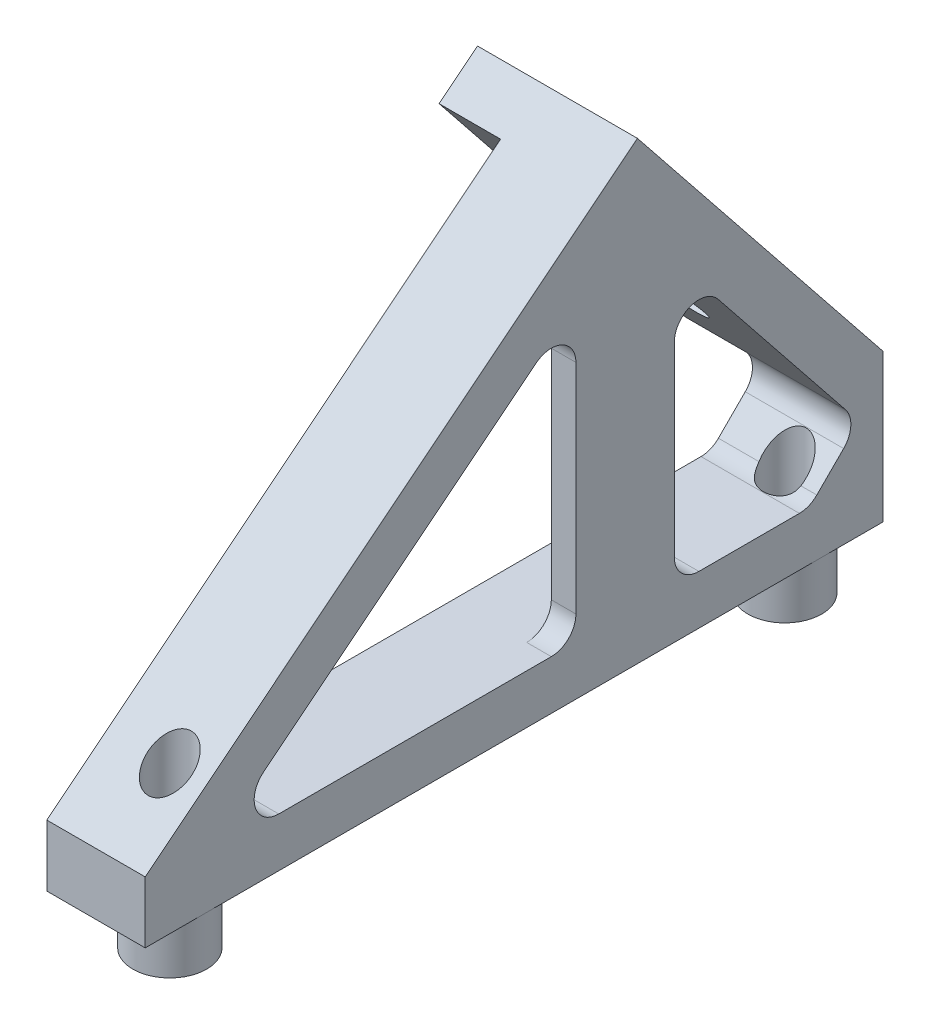
ISO-10303-21;
HEADER;
FILE_DESCRIPTION(('STEP AP214'),'2;1');
FILE_NAME('part.step','',(''),(''),'','','');
FILE_SCHEMA(('AUTOMOTIVE_DESIGN { 1 0 10303 214 1 1 1 1 }'));
ENDSEC;
DATA;
#1=APPLICATION_CONTEXT('core data for automotive mechanical design processes');
#2=APPLICATION_PROTOCOL_DEFINITION('international standard','automotive_design',2000,#1);
#3=PRODUCT_CONTEXT('',#1,'mechanical');
#4=PRODUCT('Part','Part','',(#3));
#5=PRODUCT_RELATED_PRODUCT_CATEGORY('part','',(#4));
#6=PRODUCT_DEFINITION_FORMATION('','',#4);
#7=PRODUCT_DEFINITION_CONTEXT('part definition',#1,'design');
#8=PRODUCT_DEFINITION('design','',#6,#7);
#9=PRODUCT_DEFINITION_SHAPE('','',#8);
#10=(LENGTH_UNIT() NAMED_UNIT(*) SI_UNIT(.MILLI.,.METRE.));
#11=(NAMED_UNIT(*) PLANE_ANGLE_UNIT() SI_UNIT($,.RADIAN.));
#12=(NAMED_UNIT(*) SI_UNIT($,.STERADIAN.) SOLID_ANGLE_UNIT());
#13=UNCERTAINTY_MEASURE_WITH_UNIT(LENGTH_MEASURE(1.E-05),#10,'distance_accuracy_value','');
#14=(GEOMETRIC_REPRESENTATION_CONTEXT(3) GLOBAL_UNCERTAINTY_ASSIGNED_CONTEXT((#13)) GLOBAL_UNIT_ASSIGNED_CONTEXT((#10,
#11,#12)) REPRESENTATION_CONTEXT('',''));
#15=CARTESIAN_POINT('',(0.,0.,0.));
#16=DIRECTION('',(0.,0.,1.));
#17=DIRECTION('',(1.,0.,0.));
#18=AXIS2_PLACEMENT_3D('',#15,#16,#17);
#19=CARTESIAN_POINT('',(13.,0.,0.));
#20=DIRECTION('',(0.,1.,0.));
#21=DIRECTION('',(0.,0.,1.));
#22=AXIS2_PLACEMENT_3D('',#19,#20,#21);
#23=PLANE('',#22);
#24=DIRECTION('',(0.,0.,-1.));
#25=VECTOR('',#24,1.);
#26=CARTESIAN_POINT('',(13.,0.,0.));
#27=LINE('',#26,#25);
#28=CARTESIAN_POINT('',(13.,0.,5.));
#29=VERTEX_POINT('',#28);
#30=CARTESIAN_POINT('',(13.,0.,0.));
#31=VERTEX_POINT('',#30);
#32=EDGE_CURVE('E334',#29,#31,#27,.T.);
#33=ORIENTED_EDGE('',*,*,#32,.F.);
#34=CARTESIAN_POINT('',(10.,0.,5.));
#35=DIRECTION('',(0.,-1.,0.));
#36=DIRECTION('',(0.,0.,-1.));
#37=AXIS2_PLACEMENT_3D('',#34,#35,#36);
#38=CIRCLE('',#37,3.);
#39=EDGE_CURVE('E521',#29,#29,#38,.T.);
#40=ORIENTED_EDGE('',*,*,#39,.F.);
#41=CARTESIAN_POINT('',(13.,0.,55.));
#42=VERTEX_POINT('',#41);
#43=EDGE_CURVE('E338',#42,#29,#27,.T.);
#44=ORIENTED_EDGE('',*,*,#43,.F.);
#45=CARTESIAN_POINT('',(10.,0.,55.));
#46=DIRECTION('',(0.,-1.,0.));
#47=DIRECTION('',(0.,0.,-1.));
#48=AXIS2_PLACEMENT_3D('',#45,#46,#47);
#49=CIRCLE('',#48,3.);
#50=EDGE_CURVE('E528',#42,#42,#49,.T.);
#51=ORIENTED_EDGE('',*,*,#50,.F.);
#52=CARTESIAN_POINT('',(13.,0.,60.));
#53=VERTEX_POINT('',#52);
#54=EDGE_CURVE('E335',#53,#42,#27,.T.);
#55=ORIENTED_EDGE('',*,*,#54,.F.);
#56=DIRECTION('',(-1.,0.,0.));
#57=VECTOR('',#56,1.);
#58=CARTESIAN_POINT('',(13.,0.,60.));
#59=LINE('',#58,#57);
#60=CARTESIAN_POINT('',(5.,0.,60.));
#61=VERTEX_POINT('',#60);
#62=EDGE_CURVE('E344',#53,#61,#59,.T.);
#63=ORIENTED_EDGE('',*,*,#62,.T.);
#64=DIRECTION('',(0.,0.,-1.));
#65=VECTOR('',#64,1.);
#66=CARTESIAN_POINT('',(5.,0.,0.));
#67=LINE('',#66,#65);
#68=CARTESIAN_POINT('',(5.,0.,0.));
#69=VERTEX_POINT('',#68);
#70=EDGE_CURVE('E359',#61,#69,#67,.T.);
#71=ORIENTED_EDGE('',*,*,#70,.T.);
#72=DIRECTION('',(-1.,0.,0.));
#73=VECTOR('',#72,1.);
#74=CARTESIAN_POINT('',(13.,0.,0.));
#75=LINE('',#74,#73);
#76=EDGE_CURVE('E337',#31,#69,#75,.T.);
#77=ORIENTED_EDGE('',*,*,#76,.F.);
#78=EDGE_LOOP('',(#33,#40,#44,#51,#55,#63,#71,#77));
#79=FACE_BOUND('',#78,.T.);
#80=ADVANCED_FACE('F33',(#79),#23,.F.);
#81=CARTESIAN_POINT('',(0.,27.8751456380356,24.9826212271511));
#82=DIRECTION('',(0.,0.,-1.));
#83=DIRECTION('',(0.,1.,0.));
#84=AXIS2_PLACEMENT_3D('',#81,#82,#83);
#85=PLANE('',#84);
#86=DIRECTION('',(0.,1.,0.));
#87=VECTOR('',#86,1.);
#88=CARTESIAN_POINT('',(11.,27.8751456380356,24.9826212271511));
#89=LINE('',#88,#87);
#90=CARTESIAN_POINT('',(11.,6.,24.9826212271511));
#91=VERTEX_POINT('',#90);
#92=CARTESIAN_POINT('',(11.,23.7155203644786,24.9826212271511));
#93=VERTEX_POINT('',#92);
#94=EDGE_CURVE('E398',#91,#93,#89,.T.);
#95=ORIENTED_EDGE('',*,*,#94,.F.);
#96=DIRECTION('',(1.,0.,0.));
#97=VECTOR('',#96,1.);
#98=CARTESIAN_POINT('',(13.,6.,24.9826212271511));
#99=LINE('',#98,#97);
#100=CARTESIAN_POINT('',(13.,6.,24.9826212271511));
#101=VERTEX_POINT('',#100);
#102=EDGE_CURVE('E237',#91,#101,#99,.T.);
#103=ORIENTED_EDGE('',*,*,#102,.T.);
#104=DIRECTION('',(0.,1.,0.));
#105=VECTOR('',#104,1.);
#106=CARTESIAN_POINT('',(13.,27.8751456380356,24.9826212271511));
#107=LINE('',#106,#105);
#108=CARTESIAN_POINT('',(13.,23.7155203644786,24.9826212271511));
#109=VERTEX_POINT('',#108);
#110=EDGE_CURVE('E308',#101,#109,#107,.T.);
#111=ORIENTED_EDGE('',*,*,#110,.T.);
#112=DIRECTION('',(1.,0.,0.));
#113=VECTOR('',#112,1.);
#114=CARTESIAN_POINT('',(5.,23.7155203644786,24.9826212271511));
#115=LINE('',#114,#113);
#116=EDGE_CURVE('E234',#109,#93,#115,.F.);
#117=ORIENTED_EDGE('',*,*,#116,.T.);
#118=EDGE_LOOP('',(#95,#103,#111,#117));
#119=FACE_BOUND('',#118,.T.);
#120=ADVANCED_FACE('F442',(#119),#85,.F.);
#121=CARTESIAN_POINT('',(0.,3.99999999999999,16.9826212271511));
#122=DIRECTION('',(0.,0.,1.));
#123=DIRECTION('',(1.,0.,0.));
#124=AXIS2_PLACEMENT_3D('',#121,#122,#123);
#125=PLANE('',#124);
#126=DIRECTION('',(0.,-1.,0.));
#127=VECTOR('',#126,1.);
#128=CARTESIAN_POINT('',(11.,3.99999999999999,16.9826212271511));
#129=LINE('',#128,#127);
#130=CARTESIAN_POINT('',(11.,21.131638846144,16.9826212271511));
#131=VERTEX_POINT('',#130);
#132=CARTESIAN_POINT('',(11.,5.99999999999999,16.9826212271511));
#133=VERTEX_POINT('',#132);
#134=EDGE_CURVE('E271',#131,#133,#129,.T.);
#135=ORIENTED_EDGE('',*,*,#134,.F.);
#136=DIRECTION('',(1.,0.,0.));
#137=VECTOR('',#136,1.);
#138=CARTESIAN_POINT('',(13.,21.131638846144,16.9826212271511));
#139=LINE('',#138,#137);
#140=CARTESIAN_POINT('',(13.,21.131638846144,16.9826212271511));
#141=VERTEX_POINT('',#140);
#142=EDGE_CURVE('E372',#131,#141,#139,.T.);
#143=ORIENTED_EDGE('',*,*,#142,.T.);
#144=DIRECTION('',(0.,-1.,0.));
#145=VECTOR('',#144,1.);
#146=CARTESIAN_POINT('',(13.,3.99999999999999,16.9826212271511));
#147=LINE('',#146,#145);
#148=CARTESIAN_POINT('',(13.,5.99999999999999,16.9826212271511));
#149=VERTEX_POINT('',#148);
#150=EDGE_CURVE('E288',#141,#149,#147,.T.);
#151=ORIENTED_EDGE('',*,*,#150,.T.);
#152=DIRECTION('',(1.,0.,0.));
#153=VECTOR('',#152,1.);
#154=CARTESIAN_POINT('',(5.,5.99999999999999,16.9826212271511));
#155=LINE('',#154,#153);
#156=EDGE_CURVE('E217',#149,#133,#155,.F.);
#157=ORIENTED_EDGE('',*,*,#156,.T.);
#158=EDGE_LOOP('',(#135,#143,#151,#157));
#159=FACE_BOUND('',#158,.T.);
#160=ADVANCED_FACE('F377',(#159),#125,.F.);
#161=CARTESIAN_POINT('',(0.,5.99999999999999,14.9826212271511));
#162=DIRECTION('',(-1.,0.,0.));
#163=DIRECTION('',(0.,0.,1.));
#164=AXIS2_PLACEMENT_3D('',#161,#162,#163);
#165=CYLINDRICAL_SURFACE('',#164,2.);
#166=CARTESIAN_POINT('',(11.,5.99999999999999,14.9826212271511));
#167=DIRECTION('',(-1.,0.,0.));
#168=DIRECTION('',(0.,0.,1.));
#169=AXIS2_PLACEMENT_3D('',#166,#167,#168);
#170=CIRCLE('',#169,2.);
#171=CARTESIAN_POINT('',(11.,3.99999999999999,14.9826212271511));
#172=VERTEX_POINT('',#171);
#173=EDGE_CURVE('E267',#133,#172,#170,.F.);
#174=ORIENTED_EDGE('',*,*,#173,.F.);
#175=ORIENTED_EDGE('',*,*,#156,.F.);
#176=CARTESIAN_POINT('',(13.,5.99999999999999,14.9826212271511));
#177=DIRECTION('',(-1.,0.,0.));
#178=DIRECTION('',(0.,0.,1.));
#179=AXIS2_PLACEMENT_3D('',#176,#177,#178);
#180=CIRCLE('',#179,2.);
#181=CARTESIAN_POINT('',(13.,3.99999999999999,14.9826212271511));
#182=VERTEX_POINT('',#181);
#183=EDGE_CURVE('E239',#182,#149,#180,.T.);
#184=ORIENTED_EDGE('',*,*,#183,.F.);
#185=DIRECTION('',(1.,0.,0.));
#186=VECTOR('',#185,1.);
#187=CARTESIAN_POINT('',(13.,3.99999999999999,14.9826212271511));
#188=LINE('',#187,#186);
#189=EDGE_CURVE('E370',#172,#182,#188,.T.);
#190=ORIENTED_EDGE('',*,*,#189,.F.);
#191=EDGE_LOOP('',(#174,#175,#184,#190));
#192=FACE_BOUND('',#191,.T.);
#193=ADVANCED_FACE('F383',(#192),#165,.F.);
#194=CARTESIAN_POINT('',(0.,21.131638846144,14.9826212271511));
#195=DIRECTION('',(-1.,0.,0.));
#196=DIRECTION('',(0.,0.,1.));
#197=AXIS2_PLACEMENT_3D('',#194,#195,#196);
#198=CYLINDRICAL_SURFACE('',#197,2.);
#199=CARTESIAN_POINT('',(11.,21.131638846144,14.9826212271511));
#200=DIRECTION('',(-1.,0.,0.));
#201=DIRECTION('',(0.,0.,1.));
#202=AXIS2_PLACEMENT_3D('',#199,#200,#201);
#203=CIRCLE('',#202,2.);
#204=CARTESIAN_POINT('',(11.,22.380552672841,13.4205027126058));
#205=VERTEX_POINT('',#204);
#206=EDGE_CURVE('E407',#205,#131,#203,.F.);
#207=ORIENTED_EDGE('',*,*,#206,.F.);
#208=DIRECTION('',(1.,0.,0.));
#209=VECTOR('',#208,1.);
#210=CARTESIAN_POINT('',(5.,22.380552672841,13.4205027126058));
#211=LINE('',#210,#209);
#212=CARTESIAN_POINT('',(13.,22.3805526728409,13.4205027126059));
#213=VERTEX_POINT('',#212);
#214=EDGE_CURVE('E216',#213,#205,#211,.F.);
#215=ORIENTED_EDGE('',*,*,#214,.F.);
#216=CARTESIAN_POINT('',(13.,21.131638846144,14.9826212271511));
#217=DIRECTION('',(-1.,0.,0.));
#218=DIRECTION('',(0.,0.,1.));
#219=AXIS2_PLACEMENT_3D('',#216,#217,#218);
#220=CIRCLE('',#219,2.);
#221=EDGE_CURVE('E248',#141,#213,#220,.T.);
#222=ORIENTED_EDGE('',*,*,#221,.F.);
#223=ORIENTED_EDGE('',*,*,#142,.F.);
#224=EDGE_LOOP('',(#207,#215,#222,#223));
#225=FACE_BOUND('',#224,.T.);
#226=ADVANCED_FACE('F412',(#225),#198,.F.);
#227=CARTESIAN_POINT('',(0.,5.99999999999999,26.9826212271511));
#228=DIRECTION('',(-1.,0.,0.));
#229=DIRECTION('',(0.,0.,1.));
#230=AXIS2_PLACEMENT_3D('',#227,#228,#229);
#231=CYLINDRICAL_SURFACE('',#230,2.);
#232=CARTESIAN_POINT('',(11.,5.99999999999999,26.9826212271511));
#233=DIRECTION('',(-1.,0.,0.));
#234=DIRECTION('',(0.,0.,1.));
#235=AXIS2_PLACEMENT_3D('',#232,#233,#234);
#236=CIRCLE('',#235,2.);
#237=CARTESIAN_POINT('',(11.,3.99999999999999,26.9826212271511));
#238=VERTEX_POINT('',#237);
#239=EDGE_CURVE('E405',#238,#91,#236,.F.);
#240=ORIENTED_EDGE('',*,*,#239,.F.);
#241=DIRECTION('',(1.,0.,0.));
#242=VECTOR('',#241,1.);
#243=CARTESIAN_POINT('',(5.,3.99999999999999,26.9826212271511));
#244=LINE('',#243,#242);
#245=CARTESIAN_POINT('',(13.,3.99999999999999,26.9826212271511));
#246=VERTEX_POINT('',#245);
#247=EDGE_CURVE('E225',#246,#238,#244,.F.);
#248=ORIENTED_EDGE('',*,*,#247,.F.);
#249=CARTESIAN_POINT('',(13.,5.99999999999999,26.9826212271511));
#250=DIRECTION('',(-1.,0.,0.));
#251=DIRECTION('',(0.,0.,1.));
#252=AXIS2_PLACEMENT_3D('',#249,#250,#251);
#253=CIRCLE('',#252,2.);
#254=EDGE_CURVE('E255',#101,#246,#253,.T.);
#255=ORIENTED_EDGE('',*,*,#254,.F.);
#256=ORIENTED_EDGE('',*,*,#102,.F.);
#257=EDGE_LOOP('',(#240,#248,#255,#256));
#258=FACE_BOUND('',#257,.T.);
#259=ADVANCED_FACE('F476',(#258),#231,.F.);
#260=CARTESIAN_POINT('',(0.,23.7155203644786,26.9826212271511));
#261=DIRECTION('',(-1.,0.,0.));
#262=DIRECTION('',(0.,0.,1.));
#263=AXIS2_PLACEMENT_3D('',#260,#261,#262);
#264=CYLINDRICAL_SURFACE('',#263,2.);
#265=CARTESIAN_POINT('',(11.,23.7155203644786,26.9826212271511));
#266=DIRECTION('',(-1.,0.,0.));
#267=DIRECTION('',(0.,0.,1.));
#268=AXIS2_PLACEMENT_3D('',#265,#266,#267);
#269=CIRCLE('',#268,2.);
#270=CARTESIAN_POINT('',(11.,25.2776388790238,28.2315350538481));
#271=VERTEX_POINT('',#270);
#272=EDGE_CURVE('E11',#93,#271,#269,.F.);
#273=ORIENTED_EDGE('',*,*,#272,.F.);
#274=ORIENTED_EDGE('',*,*,#116,.F.);
#275=CARTESIAN_POINT('',(13.,23.7155203644786,26.9826212271511));
#276=DIRECTION('',(-1.,0.,0.));
#277=DIRECTION('',(0.,0.,1.));
#278=AXIS2_PLACEMENT_3D('',#275,#276,#277);
#279=CIRCLE('',#278,2.);
#280=CARTESIAN_POINT('',(13.,25.2776388790239,28.2315350538481));
#281=VERTEX_POINT('',#280);
#282=EDGE_CURVE('E41',#281,#109,#279,.T.);
#283=ORIENTED_EDGE('',*,*,#282,.F.);
#284=DIRECTION('',(1.,0.,0.));
#285=VECTOR('',#284,1.);
#286=CARTESIAN_POINT('',(13.,25.2776388790239,28.2315350538481));
#287=LINE('',#286,#285);
#288=EDGE_CURVE('E230',#271,#281,#287,.T.);
#289=ORIENTED_EDGE('',*,*,#288,.F.);
#290=EDGE_LOOP('',(#273,#274,#283,#289));
#291=FACE_BOUND('',#290,.T.);
#292=ADVANCED_FACE('F35',(#291),#264,.F.);
#293=CARTESIAN_POINT('',(13.,12.,0.));
#294=DIRECTION('',(0.,0.,1.));
#295=DIRECTION('',(0.,-1.,0.));
#296=AXIS2_PLACEMENT_3D('',#293,#294,#295);
#297=PLANE('',#296);
#298=DIRECTION('',(0.,1.,0.));
#299=VECTOR('',#298,1.);
#300=CARTESIAN_POINT('',(5.,12.,0.));
#301=LINE('',#300,#299);
#302=CARTESIAN_POINT('',(5.,12.,0.));
#303=VERTEX_POINT('',#302);
#304=EDGE_CURVE('E321',#69,#303,#301,.T.);
#305=ORIENTED_EDGE('',*,*,#304,.T.);
#306=DIRECTION('',(-1.,0.,0.));
#307=VECTOR('',#306,1.);
#308=CARTESIAN_POINT('',(13.,12.,0.));
#309=LINE('',#308,#307);
#310=CARTESIAN_POINT('',(13.,12.,0.));
#311=VERTEX_POINT('',#310);
#312=EDGE_CURVE('E353',#311,#303,#309,.T.);
#313=ORIENTED_EDGE('',*,*,#312,.F.);
#314=DIRECTION('',(0.,1.,0.));
#315=VECTOR('',#314,1.);
#316=CARTESIAN_POINT('',(13.,12.,0.));
#317=LINE('',#316,#315);
#318=EDGE_CURVE('E324',#31,#311,#317,.T.);
#319=ORIENTED_EDGE('',*,*,#318,.F.);
#320=ORIENTED_EDGE('',*,*,#76,.T.);
#321=EDGE_LOOP('',(#305,#313,#319,#320));
#322=FACE_BOUND('',#321,.T.);
#323=ADVANCED_FACE('F466',(#322),#297,.F.);
#324=CARTESIAN_POINT('',(13.,36.9938962327247,19.9826212271511));
#325=DIRECTION('',(0.,-0.624456913348472,0.781059257272647));
#326=DIRECTION('',(0.,-0.781059257272647,-0.624456913348472));
#327=AXIS2_PLACEMENT_3D('',#324,#325,#326);
#328=PLANE('',#327);
#329=CARTESIAN_POINT('',(4.,17.4674148009085,4.37119839343931));
#330=DIRECTION('',(0.,0.624456913348472,-0.781059257272647));
#331=DIRECTION('',(0.,0.781059257272647,0.624456913348472));
#332=AXIS2_PLACEMENT_3D('',#329,#330,#331);
#333=CIRCLE('',#332,2.);
#334=CARTESIAN_POINT('',(4.,19.0295333154538,5.62011222013625));
#335=VERTEX_POINT('',#334);
#336=EDGE_CURVE('E260',#335,#335,#333,.T.);
#337=ORIENTED_EDGE('',*,*,#336,.F.);
#338=EDGE_LOOP('',(#337));
#339=FACE_BOUND('',#338,.T.);
#340=CARTESIAN_POINT('',(4.,31.5264814318162,15.6114228337118));
#341=DIRECTION('',(0.,0.624456913348472,-0.781059257272647));
#342=DIRECTION('',(0.,0.781059257272647,0.624456913348472));
#343=AXIS2_PLACEMENT_3D('',#340,#341,#342);
#344=CIRCLE('',#343,2.);
#345=CARTESIAN_POINT('',(4.,33.0885999463615,16.8603366604088));
#346=VERTEX_POINT('',#345);
#347=EDGE_CURVE('E259',#346,#346,#344,.T.);
#348=ORIENTED_EDGE('',*,*,#347,.F.);
#349=EDGE_LOOP('',(#348));
#350=FACE_BOUND('',#349,.T.);
#351=DIRECTION('',(0.,0.781059257272647,0.624456913348473));
#352=VECTOR('',#351,1.);
#353=CARTESIAN_POINT('',(0.,36.9938962327247,19.9826212271511));
#354=LINE('',#353,#352);
#355=CARTESIAN_POINT('',(0.,12.,0.));
#356=VERTEX_POINT('',#355);
#357=CARTESIAN_POINT('',(0.,36.9938962327247,19.9826212271511));
#358=VERTEX_POINT('',#357);
#359=EDGE_CURVE('E323',#356,#358,#354,.T.);
#360=ORIENTED_EDGE('',*,*,#359,.T.);
#361=DIRECTION('',(-1.,0.,0.));
#362=VECTOR('',#361,1.);
#363=CARTESIAN_POINT('',(13.,36.9938962327247,19.9826212271511));
#364=LINE('',#363,#362);
#365=CARTESIAN_POINT('',(13.,36.9938962327247,19.9826212271511));
#366=VERTEX_POINT('',#365);
#367=EDGE_CURVE('E350',#366,#358,#364,.T.);
#368=ORIENTED_EDGE('',*,*,#367,.F.);
#369=DIRECTION('',(0.,0.781059257272647,0.624456913348473));
#370=VECTOR('',#369,1.);
#371=CARTESIAN_POINT('',(13.,36.9938962327247,19.9826212271511));
#372=LINE('',#371,#370);
#373=EDGE_CURVE('E327',#311,#366,#372,.T.);
#374=ORIENTED_EDGE('',*,*,#373,.F.);
#375=ORIENTED_EDGE('',*,*,#312,.T.);
#376=DIRECTION('',(-1.,0.,0.));
#377=VECTOR('',#376,1.);
#378=CARTESIAN_POINT('',(13.,12.,0.));
#379=LINE('',#378,#377);
#380=EDGE_CURVE('E284',#303,#356,#379,.T.);
#381=ORIENTED_EDGE('',*,*,#380,.T.);
#382=EDGE_LOOP('',(#360,#368,#374,#375,#381));
#383=FACE_BOUND('',#382,.T.);
#384=ADVANCED_FACE('F462',(#339,#350,#383),#328,.F.);
#385=CARTESIAN_POINT('',(13.,4.99999999999999,60.));
#386=DIRECTION('',(0.,-0.781059257272644,-0.624456913348475));
#387=DIRECTION('',(0.,0.624456913348475,-0.781059257272644));
#388=AXIS2_PLACEMENT_3D('',#385,#386,#387);
#389=PLANE('',#388);
#390=CARTESIAN_POINT('',(10.,8.99750023787564,55.));
#391=DIRECTION('',(0.,-0.781059257272644,-0.624456913348475));
#392=DIRECTION('',(0.,-0.624456913348475,0.781059257272644));
#393=AXIS2_PLACEMENT_3D('',#390,#391,#392);
#394=ELLIPSE('',#393,2.2405470311059,1.75);
#395=CARTESIAN_POINT('',(10.,7.59837515461916,56.75));
#396=VERTEX_POINT('',#395);
#397=EDGE_CURVE('E525',#396,#396,#394,.F.);
#398=ORIENTED_EDGE('',*,*,#397,.F.);
#399=EDGE_LOOP('',(#398));
#400=FACE_BOUND('',#399,.T.);
#401=DIRECTION('',(0.,-0.624456913348475,0.781059257272644));
#402=VECTOR('',#401,1.);
#403=CARTESIAN_POINT('',(0.,4.99999999999999,60.));
#404=LINE('',#403,#402);
#405=CARTESIAN_POINT('',(0.,34.4960685793308,23.1068582562417));
#406=VERTEX_POINT('',#405);
#407=EDGE_CURVE('E328',#358,#406,#404,.T.);
#408=ORIENTED_EDGE('',*,*,#407,.T.);
#409=DIRECTION('',(-1.,0.,0.));
#410=VECTOR('',#409,1.);
#411=CARTESIAN_POINT('',(0.,34.4960685793308,23.1068582562417));
#412=LINE('',#411,#410);
#413=CARTESIAN_POINT('',(5.,34.4960685793308,23.1068582562417));
#414=VERTEX_POINT('',#413);
#415=EDGE_CURVE('E314',#414,#406,#412,.T.);
#416=ORIENTED_EDGE('',*,*,#415,.F.);
#417=DIRECTION('',(0.,0.624456913348475,-0.781059257272644));
#418=VECTOR('',#417,1.);
#419=CARTESIAN_POINT('',(5.,34.4960685793308,23.1068582562417));
#420=LINE('',#419,#418);
#421=CARTESIAN_POINT('',(5.,5.00000000000001,60.));
#422=VERTEX_POINT('',#421);
#423=EDGE_CURVE('E311',#422,#414,#420,.T.);
#424=ORIENTED_EDGE('',*,*,#423,.F.);
#425=DIRECTION('',(-1.,0.,0.));
#426=VECTOR('',#425,1.);
#427=CARTESIAN_POINT('',(13.,4.99999999999999,60.));
#428=LINE('',#427,#426);
#429=CARTESIAN_POINT('',(13.,4.99999999999999,60.));
#430=VERTEX_POINT('',#429);
#431=EDGE_CURVE('E347',#430,#422,#428,.T.);
#432=ORIENTED_EDGE('',*,*,#431,.F.);
#433=DIRECTION('',(0.,-0.624456913348475,0.781059257272644));
#434=VECTOR('',#433,1.);
#435=CARTESIAN_POINT('',(13.,4.99999999999999,60.));
#436=LINE('',#435,#434);
#437=EDGE_CURVE('E330',#366,#430,#436,.T.);
#438=ORIENTED_EDGE('',*,*,#437,.F.);
#439=ORIENTED_EDGE('',*,*,#367,.T.);
#440=EDGE_LOOP('',(#408,#416,#424,#432,#438,#439));
#441=FACE_BOUND('',#440,.T.);
#442=ADVANCED_FACE('F458',(#400,#441),#389,.F.);
#443=CARTESIAN_POINT('',(13.,0.,60.));
#444=DIRECTION('',(0.,0.,-1.));
#445=DIRECTION('',(-1.,0.,0.));
#446=AXIS2_PLACEMENT_3D('',#443,#444,#445);
#447=PLANE('',#446);
#448=ORIENTED_EDGE('',*,*,#431,.T.);
#449=DIRECTION('',(0.,-1.,0.));
#450=VECTOR('',#449,1.);
#451=CARTESIAN_POINT('',(5.,0.,60.));
#452=LINE('',#451,#450);
#453=EDGE_CURVE('E318',#422,#61,#452,.T.);
#454=ORIENTED_EDGE('',*,*,#453,.T.);
#455=ORIENTED_EDGE('',*,*,#62,.F.);
#456=DIRECTION('',(0.,-1.,0.));
#457=VECTOR('',#456,1.);
#458=CARTESIAN_POINT('',(13.,0.,60.));
#459=LINE('',#458,#457);
#460=EDGE_CURVE('E332',#430,#53,#459,.T.);
#461=ORIENTED_EDGE('',*,*,#460,.F.);
#462=EDGE_LOOP('',(#448,#454,#455,#461));
#463=FACE_BOUND('',#462,.T.);
#464=ADVANCED_FACE('F455',(#463),#447,.F.);
#465=CARTESIAN_POINT('',(13.,0.,0.));
#466=DIRECTION('',(-1.,0.,0.));
#467=DIRECTION('',(0.,0.,1.));
#468=AXIS2_PLACEMENT_3D('',#465,#466,#467);
#469=PLANE('',#468);
#470=DIRECTION('',(0.,0.,-1.));
#471=VECTOR('',#470,1.);
#472=CARTESIAN_POINT('',(13.,4.,5.98262122715113));
#473=LINE('',#472,#471);
#474=CARTESIAN_POINT('',(13.,4.,6.81104835189732));
#475=VERTEX_POINT('',#474);
#476=EDGE_CURVE('E291',#182,#475,#473,.T.);
#477=ORIENTED_EDGE('',*,*,#476,.F.);
#478=ORIENTED_EDGE('',*,*,#183,.T.);
#479=ORIENTED_EDGE('',*,*,#150,.F.);
#480=ORIENTED_EDGE('',*,*,#221,.T.);
#481=DIRECTION('',(0.,0.781059257272647,0.624456913348473));
#482=VECTOR('',#481,1.);
#483=CARTESIAN_POINT('',(13.,26.83598519639,16.9826212271511));
#484=LINE('',#483,#482);
#485=CARTESIAN_POINT('',(13.,9.4307271072348,3.0671165568142));
#486=VERTEX_POINT('',#485);
#487=EDGE_CURVE('E296',#486,#213,#484,.T.);
#488=ORIENTED_EDGE('',*,*,#487,.F.);
#489=CARTESIAN_POINT('',(13.,8.18181328053791,4.62923507135941));
#490=DIRECTION('',(-1.,0.,0.));
#491=DIRECTION('',(0.,0.,1.));
#492=AXIS2_PLACEMENT_3D('',#489,#490,#491);
#493=CIRCLE('',#492,2.);
#494=CARTESIAN_POINT('',(13.,6.76759971816483,3.21502150898631));
#495=VERTEX_POINT('',#494);
#496=EDGE_CURVE('E244',#486,#495,#493,.T.);
#497=ORIENTED_EDGE('',*,*,#496,.T.);
#498=DIRECTION('',(0.,0.707106781186549,-0.707106781186546));
#499=VECTOR('',#498,1.);
#500=CARTESIAN_POINT('',(13.,8.03299308645098,1.94962814070017));
#501=LINE('',#500,#499);
#502=CARTESIAN_POINT('',(13.,4.58578643762691,5.39683478952422));
#503=VERTEX_POINT('',#502);
#504=EDGE_CURVE('E294',#503,#495,#501,.T.);
#505=ORIENTED_EDGE('',*,*,#504,.F.);
#506=CARTESIAN_POINT('',(13.,6.,6.81104835189732));
#507=DIRECTION('',(-1.,0.,0.));
#508=DIRECTION('',(0.,0.,1.));
#509=AXIS2_PLACEMENT_3D('',#506,#507,#508);
#510=CIRCLE('',#509,2.);
#511=EDGE_CURVE('E212',#503,#475,#510,.T.);
#512=ORIENTED_EDGE('',*,*,#511,.T.);
#513=EDGE_LOOP('',(#477,#478,#479,#480,#488,#497,#505,#512));
#514=FACE_BOUND('',#513,.T.);
#515=DIRECTION('',(0.,0.,-1.));
#516=VECTOR('',#515,1.);
#517=CARTESIAN_POINT('',(13.,3.99999999999999,24.9826212271511));
#518=LINE('',#517,#516);
#519=CARTESIAN_POINT('',(13.,3.99999999999999,49.1408692700492));
#520=VERTEX_POINT('',#519);
#521=EDGE_CURVE('E305',#520,#246,#518,.T.);
#522=ORIENTED_EDGE('',*,*,#521,.F.);
#523=CARTESIAN_POINT('',(13.,5.99999999999999,49.1408692700492));
#524=DIRECTION('',(-1.,0.,0.));
#525=DIRECTION('',(0.,0.,1.));
#526=AXIS2_PLACEMENT_3D('',#523,#524,#525);
#527=CIRCLE('',#526,2.);
#528=CARTESIAN_POINT('',(13.,7.56211851454528,50.3897830967462));
#529=VERTEX_POINT('',#528);
#530=EDGE_CURVE('E250',#520,#529,#527,.T.);
#531=ORIENTED_EDGE('',*,*,#530,.T.);
#532=DIRECTION('',(0.,-0.624456913348476,0.781059257272644));
#533=VECTOR('',#532,1.);
#534=CARTESIAN_POINT('',(13.,3.99999999999999,54.8452156202953));
#535=LINE('',#534,#533);
#536=EDGE_CURVE('E302',#281,#529,#535,.T.);
#537=ORIENTED_EDGE('',*,*,#536,.F.);
#538=ORIENTED_EDGE('',*,*,#282,.T.);
#539=ORIENTED_EDGE('',*,*,#110,.F.);
#540=ORIENTED_EDGE('',*,*,#254,.T.);
#541=EDGE_LOOP('',(#522,#531,#537,#538,#539,#540));
#542=FACE_BOUND('',#541,.T.);
#543=ORIENTED_EDGE('',*,*,#318,.T.);
#544=ORIENTED_EDGE('',*,*,#373,.T.);
#545=ORIENTED_EDGE('',*,*,#437,.T.);
#546=ORIENTED_EDGE('',*,*,#460,.T.);
#547=ORIENTED_EDGE('',*,*,#54,.T.);
#548=ORIENTED_EDGE('',*,*,#43,.T.);
#549=ORIENTED_EDGE('',*,*,#32,.T.);
#550=EDGE_LOOP('',(#543,#544,#545,#546,#547,#548,#549));
#551=FACE_BOUND('',#550,.T.);
#552=ADVANCED_FACE('F421',(#514,#542,#551),#469,.F.);
#553=CARTESIAN_POINT('',(0.,0.,0.));
#554=DIRECTION('',(-1.,0.,0.));
#555=DIRECTION('',(0.,0.,1.));
#556=AXIS2_PLACEMENT_3D('',#553,#554,#555);
#557=PLANE('',#556);
#558=DIRECTION('',(0.,-0.624456913348475,0.781059257272644));
#559=VECTOR('',#558,1.);
#560=CARTESIAN_POINT('',(0.,17.6201122201363,-7.02953331545388));
#561=LINE('',#560,#559);
#562=CARTESIAN_POINT('',(0.,9.50217234660617,3.12423702909049));
#563=VERTEX_POINT('',#562);
#564=EDGE_CURVE('E281',#356,#563,#561,.T.);
#565=ORIENTED_EDGE('',*,*,#564,.T.);
#566=DIRECTION('',(0.,-0.781059257272645,-0.624456913348475));
#567=VECTOR('',#566,1.);
#568=CARTESIAN_POINT('',(0.,2.18152958615063,-2.72861720617424));
#569=LINE('',#568,#567);
#570=EDGE_CURVE('E356',#406,#563,#569,.T.);
#571=ORIENTED_EDGE('',*,*,#570,.F.);
#572=ORIENTED_EDGE('',*,*,#407,.F.);
#573=ORIENTED_EDGE('',*,*,#359,.F.);
#574=EDGE_LOOP('',(#565,#571,#572,#573));
#575=FACE_BOUND('',#574,.T.);
#576=ADVANCED_FACE('F453',(#575),#557,.T.);
#577=CARTESIAN_POINT('',(5.,2.18152958615062,-2.72861720617425));
#578=DIRECTION('',(1.,0.,0.));
#579=DIRECTION('',(0.,0.,-1.));
#580=AXIS2_PLACEMENT_3D('',#577,#578,#579);
#581=PLANE('',#580);
#582=CARTESIAN_POINT('',(5.,5.99999999999999,49.1408692700492));
#583=DIRECTION('',(1.,0.,0.));
#584=DIRECTION('',(0.,0.,-1.));
#585=AXIS2_PLACEMENT_3D('',#582,#583,#584);
#586=CIRCLE('',#585,2.);
#587=CARTESIAN_POINT('',(5.,7.56211851454527,50.3897830967462));
#588=VERTEX_POINT('',#587);
#589=CARTESIAN_POINT('',(5.,3.99999999999999,49.1408692700492));
#590=VERTEX_POINT('',#589);
#591=EDGE_CURVE('E252',#588,#590,#586,.T.);
#592=ORIENTED_EDGE('',*,*,#591,.T.);
#593=DIRECTION('',(0.,0.,-1.));
#594=VECTOR('',#593,1.);
#595=CARTESIAN_POINT('',(5.,4.,-2.72861720617425));
#596=LINE('',#595,#594);
#597=CARTESIAN_POINT('',(5.,4.,6.81104835189732));
#598=VERTEX_POINT('',#597);
#599=EDGE_CURVE('E365',#590,#598,#596,.T.);
#600=ORIENTED_EDGE('',*,*,#599,.T.);
#601=CARTESIAN_POINT('',(5.,6.,6.81104835189732));
#602=DIRECTION('',(1.,0.,0.));
#603=DIRECTION('',(0.,0.,-1.));
#604=AXIS2_PLACEMENT_3D('',#601,#602,#603);
#605=CIRCLE('',#604,2.);
#606=CARTESIAN_POINT('',(5.,4.5857864376269,5.39683478952422));
#607=VERTEX_POINT('',#606);
#608=EDGE_CURVE('E242',#598,#607,#605,.T.);
#609=ORIENTED_EDGE('',*,*,#608,.T.);
#610=DIRECTION('',(0.,0.707106781186549,-0.707106781186546));
#611=VECTOR('',#610,1.);
#612=CARTESIAN_POINT('',(5.,7.44638400973799,2.53623721741315));
#613=LINE('',#612,#611);
#614=CARTESIAN_POINT('',(5.,6.76759971816482,3.21502150898631));
#615=VERTEX_POINT('',#614);
#616=EDGE_CURVE('E299',#607,#615,#613,.T.);
#617=ORIENTED_EDGE('',*,*,#616,.T.);
#618=CARTESIAN_POINT('',(5.,8.18181328053791,4.62923507135941));
#619=DIRECTION('',(1.,0.,0.));
#620=DIRECTION('',(0.,0.,-1.));
#621=AXIS2_PLACEMENT_3D('',#618,#619,#620);
#622=CIRCLE('',#621,2.);
#623=CARTESIAN_POINT('',(5.,9.43072710723487,3.06711655681412));
#624=VERTEX_POINT('',#623);
#625=EDGE_CURVE('E246',#615,#624,#622,.T.);
#626=ORIENTED_EDGE('',*,*,#625,.T.);
#627=DIRECTION('',(0.,0.781059257272644,0.624456913348475));
#628=VECTOR('',#627,1.);
#629=CARTESIAN_POINT('',(5.,9.50217234660617,3.12423702909049));
#630=LINE('',#629,#628);
#631=CARTESIAN_POINT('',(5.,9.50217234660617,3.12423702909049));
#632=VERTEX_POINT('',#631);
#633=EDGE_CURVE('E55',#624,#632,#630,.T.);
#634=ORIENTED_EDGE('',*,*,#633,.T.);
#635=DIRECTION('',(0.,-0.624456913348475,0.781059257272644));
#636=VECTOR('',#635,1.);
#637=CARTESIAN_POINT('',(5.,17.6201122201363,-7.02953331545388));
#638=LINE('',#637,#636);
#639=EDGE_CURVE('E280',#303,#632,#638,.T.);
#640=ORIENTED_EDGE('',*,*,#639,.F.);
#641=ORIENTED_EDGE('',*,*,#304,.F.);
#642=ORIENTED_EDGE('',*,*,#70,.F.);
#643=ORIENTED_EDGE('',*,*,#453,.F.);
#644=ORIENTED_EDGE('',*,*,#423,.T.);
#645=DIRECTION('',(0.,0.781059257272644,0.624456913348475));
#646=VECTOR('',#645,1.);
#647=CARTESIAN_POINT('',(5.,2.18152958615062,-2.72861720617425));
#648=LINE('',#647,#646);
#649=CARTESIAN_POINT('',(5.,31.3718315502402,20.6090306028478));
#650=VERTEX_POINT('',#649);
#651=EDGE_CURVE('E316',#650,#414,#648,.T.);
#652=ORIENTED_EDGE('',*,*,#651,.F.);
#653=DIRECTION('',(0.,-0.624456913348476,0.781059257272644));
#654=VECTOR('',#653,1.);
#655=CARTESIAN_POINT('',(5.,31.3718315502402,20.6090306028478));
#656=LINE('',#655,#654);
#657=EDGE_CURVE('E362',#650,#588,#656,.T.);
#658=ORIENTED_EDGE('',*,*,#657,.T.);
#659=EDGE_LOOP('',(#592,#600,#609,#617,#626,#634,#640,#641,#642,#643,#644,#652,#658));
#660=FACE_BOUND('',#659,.T.);
#661=ADVANCED_FACE('F424',(#660),#581,.F.);
#662=CARTESIAN_POINT('',(0.,2.18152958615062,-2.72861720617425));
#663=DIRECTION('',(0.,0.624456913348475,-0.781059257272644));
#664=DIRECTION('',(0.,0.781059257272645,0.624456913348475));
#665=AXIS2_PLACEMENT_3D('',#662,#663,#664);
#666=PLANE('',#665);
#667=CARTESIAN_POINT('',(4.,14.9695871475147,7.49543542252983));
#668=DIRECTION('',(0.,0.624456913348475,-0.781059257272644));
#669=DIRECTION('',(0.,0.781059257272645,0.624456913348475));
#670=AXIS2_PLACEMENT_3D('',#667,#668,#669);
#671=CIRCLE('',#670,2.);
#672=CARTESIAN_POINT('',(4.,16.53170566206,8.74434924922678));
#673=VERTEX_POINT('',#672);
#674=EDGE_CURVE('E257',#673,#673,#671,.T.);
#675=ORIENTED_EDGE('',*,*,#674,.T.);
#676=EDGE_LOOP('',(#675));
#677=FACE_BOUND('',#676,.T.);
#678=CARTESIAN_POINT('',(4.,29.0286537784223,18.7356598628024));
#679=DIRECTION('',(0.,0.624456913348475,-0.781059257272644));
#680=DIRECTION('',(0.,0.781059257272645,0.624456913348475));
#681=AXIS2_PLACEMENT_3D('',#678,#679,#680);
#682=CIRCLE('',#681,2.);
#683=CARTESIAN_POINT('',(4.,30.5907722929676,19.9845736894993));
#684=VERTEX_POINT('',#683);
#685=EDGE_CURVE('E264',#684,#684,#682,.T.);
#686=ORIENTED_EDGE('',*,*,#685,.T.);
#687=EDGE_LOOP('',(#686));
#688=FACE_BOUND('',#687,.T.);
#689=DIRECTION('',(-1.,0.,0.));
#690=VECTOR('',#689,1.);
#691=CARTESIAN_POINT('',(0.,9.50217234660617,3.12423702909049));
#692=LINE('',#691,#690);
#693=EDGE_CURVE('E278',#632,#563,#692,.T.);
#694=ORIENTED_EDGE('',*,*,#693,.F.);
#695=ORIENTED_EDGE('',*,*,#633,.F.);
#696=DIRECTION('',(1.,0.,0.));
#697=VECTOR('',#696,1.);
#698=CARTESIAN_POINT('',(13.,9.43072710723487,3.06711655681412));
#699=LINE('',#698,#697);
#700=EDGE_CURVE('E223',#624,#486,#699,.T.);
#701=ORIENTED_EDGE('',*,*,#700,.T.);
#702=ORIENTED_EDGE('',*,*,#487,.T.);
#703=ORIENTED_EDGE('',*,*,#214,.T.);
#704=DIRECTION('',(0.,-0.781059257272645,-0.624456913348475));
#705=VECTOR('',#704,1.);
#706=CARTESIAN_POINT('',(11.,31.3718315502402,20.6090306028478));
#707=LINE('',#706,#705);
#708=CARTESIAN_POINT('',(11.,31.3718315502402,20.6090306028478));
#709=VERTEX_POINT('',#708);
#710=EDGE_CURVE('E395',#709,#205,#707,.T.);
#711=ORIENTED_EDGE('',*,*,#710,.F.);
#712=DIRECTION('',(-1.,0.,0.));
#713=VECTOR('',#712,1.);
#714=CARTESIAN_POINT('',(11.,31.3718315502402,20.6090306028478));
#715=LINE('',#714,#713);
#716=EDGE_CURVE('E394',#709,#650,#715,.T.);
#717=ORIENTED_EDGE('',*,*,#716,.T.);
#718=ORIENTED_EDGE('',*,*,#651,.T.);
#719=ORIENTED_EDGE('',*,*,#415,.T.);
#720=ORIENTED_EDGE('',*,*,#570,.T.);
#721=EDGE_LOOP('',(#694,#695,#701,#702,#703,#711,#717,#718,#719,#720));
#722=FACE_BOUND('',#721,.T.);
#723=ADVANCED_FACE('F416',(#677,#688,#722),#666,.F.);
#724=CARTESIAN_POINT('',(0.,3.99999999999999,54.8452156202953));
#725=DIRECTION('',(0.,0.781059257272644,0.624456913348476));
#726=DIRECTION('',(0.,-0.624456913348476,0.781059257272644));
#727=AXIS2_PLACEMENT_3D('',#724,#725,#726);
#728=PLANE('',#727);
#729=ORIENTED_EDGE('',*,*,#657,.F.);
#730=ORIENTED_EDGE('',*,*,#716,.F.);
#731=DIRECTION('',(0.,0.624456913348475,-0.781059257272644));
#732=VECTOR('',#731,1.);
#733=CARTESIAN_POINT('',(11.,31.3718315502402,20.6090306028478));
#734=LINE('',#733,#732);
#735=EDGE_CURVE('E400',#271,#709,#734,.T.);
#736=ORIENTED_EDGE('',*,*,#735,.F.);
#737=ORIENTED_EDGE('',*,*,#288,.T.);
#738=ORIENTED_EDGE('',*,*,#536,.T.);
#739=DIRECTION('',(1.,0.,0.));
#740=VECTOR('',#739,1.);
#741=CARTESIAN_POINT('',(5.,7.56211851454528,50.3897830967462));
#742=LINE('',#741,#740);
#743=EDGE_CURVE('E232',#529,#588,#742,.F.);
#744=ORIENTED_EDGE('',*,*,#743,.T.);
#745=EDGE_LOOP('',(#729,#730,#736,#737,#738,#744));
#746=FACE_BOUND('',#745,.T.);
#747=ADVANCED_FACE('F485',(#746),#728,.F.);
#748=CARTESIAN_POINT('',(0.,3.99999999999999,24.9826212271511));
#749=DIRECTION('',(0.,-1.,0.));
#750=DIRECTION('',(0.,0.,-1.));
#751=AXIS2_PLACEMENT_3D('',#748,#749,#750);
#752=PLANE('',#751);
#753=DIRECTION('',(1.,0.,0.));
#754=VECTOR('',#753,1.);
#755=CARTESIAN_POINT('',(13.,3.99999999999999,49.1408692700492));
#756=LINE('',#755,#754);
#757=EDGE_CURVE('E228',#590,#520,#756,.T.);
#758=ORIENTED_EDGE('',*,*,#757,.T.);
#759=ORIENTED_EDGE('',*,*,#521,.T.);
#760=ORIENTED_EDGE('',*,*,#247,.T.);
#761=DIRECTION('',(0.,0.,1.));
#762=VECTOR('',#761,1.);
#763=CARTESIAN_POINT('',(11.,4.,6.81104835189732));
#764=LINE('',#763,#762);
#765=EDGE_CURVE('E389',#172,#238,#764,.T.);
#766=ORIENTED_EDGE('',*,*,#765,.F.);
#767=ORIENTED_EDGE('',*,*,#189,.T.);
#768=ORIENTED_EDGE('',*,*,#476,.T.);
#769=DIRECTION('',(1.,0.,0.));
#770=VECTOR('',#769,1.);
#771=CARTESIAN_POINT('',(5.,4.,6.81104835189732));
#772=LINE('',#771,#770);
#773=EDGE_CURVE('E368',#475,#598,#772,.F.);
#774=ORIENTED_EDGE('',*,*,#773,.T.);
#775=ORIENTED_EDGE('',*,*,#599,.F.);
#776=EDGE_LOOP('',(#758,#759,#760,#766,#767,#768,#774,#775));
#777=FACE_BOUND('',#776,.T.);
#778=ADVANCED_FACE('F392',(#777),#752,.F.);
#779=CARTESIAN_POINT('',(0.,8.03299308645098,1.94962814070017));
#780=DIRECTION('',(0.,-0.707106781186546,-0.707106781186549));
#781=DIRECTION('',(0.,0.707106781186549,-0.707106781186546));
#782=AXIS2_PLACEMENT_3D('',#779,#780,#781);
#783=PLANE('',#782);
#784=DIRECTION('',(1.,0.,0.));
#785=VECTOR('',#784,1.);
#786=CARTESIAN_POINT('',(13.,4.5857864376269,5.39683478952422));
#787=LINE('',#786,#785);
#788=CARTESIAN_POINT('',(8.29558744729356,4.5857864376269,5.39683478952422));
#789=VERTEX_POINT('',#788);
#790=EDGE_CURVE('E207',#607,#789,#787,.T.);
#791=ORIENTED_EDGE('',*,*,#790,.T.);
#792=CARTESIAN_POINT('',(10.,4.98262122715113,5.));
#793=DIRECTION('',(0.,-0.707106781186546,-0.707106781186549));
#794=DIRECTION('',(0.,-0.707106781186549,0.707106781186546));
#795=AXIS2_PLACEMENT_3D('',#792,#793,#794);
#796=ELLIPSE('',#795,2.47487373415292,1.75);
#797=CARTESIAN_POINT('',(11.7044125527064,4.5857864376269,5.39683478952422));
#798=VERTEX_POINT('',#797);
#799=EDGE_CURVE('E47',#798,#789,#796,.F.);
#800=ORIENTED_EDGE('',*,*,#799,.F.);
#801=EDGE_CURVE('E204',#798,#503,#787,.T.);
#802=ORIENTED_EDGE('',*,*,#801,.T.);
#803=ORIENTED_EDGE('',*,*,#504,.T.);
#804=DIRECTION('',(1.,0.,0.));
#805=VECTOR('',#804,1.);
#806=CARTESIAN_POINT('',(5.,6.76759971816482,3.21502150898631));
#807=LINE('',#806,#805);
#808=EDGE_CURVE('E214',#495,#615,#807,.F.);
#809=ORIENTED_EDGE('',*,*,#808,.T.);
#810=ORIENTED_EDGE('',*,*,#616,.F.);
#811=EDGE_LOOP('',(#791,#800,#802,#803,#809,#810));
#812=FACE_BOUND('',#811,.T.);
#813=ADVANCED_FACE('F202',(#812),#783,.F.);
#814=CARTESIAN_POINT('',(0.,6.,6.81104835189732));
#815=DIRECTION('',(-1.,0.,0.));
#816=DIRECTION('',(0.,0.,1.));
#817=AXIS2_PLACEMENT_3D('',#814,#815,#816);
#818=CYLINDRICAL_SURFACE('',#817,2.);
#819=ORIENTED_EDGE('',*,*,#801,.F.);
#820=CARTESIAN_POINT('',(8.29558744729356,4.58578643762691,5.39683478952422));
#821=CARTESIAN_POINT('',(8.30237430661895,4.55661164101087,5.42599705669401));
#822=CARTESIAN_POINT('',(8.3101440629872,4.52845966389894,5.45596614788278));
#823=CARTESIAN_POINT('',(8.32787552856729,4.47433109511321,5.51721818331431));
#824=CARTESIAN_POINT('',(8.33783831463283,4.44835558083983,5.54850176689102));
#825=CARTESIAN_POINT('',(8.36016681592867,4.39875853940088,5.61202823481423));
#826=CARTESIAN_POINT('',(8.37253060142761,4.37513514470266,5.64427033127639));
#827=CARTESIAN_POINT('',(8.39981640747604,4.33032974414087,5.70933824163843));
#828=CARTESIAN_POINT('',(8.41473788274471,4.30914721950792,5.74216392978662));
#829=CARTESIAN_POINT('',(8.46366343810198,4.24920551613658,5.84117450638119));
#830=CARTESIAN_POINT('',(8.5017648877464,4.21419863484478,5.90770197395347));
#831=CARTESIAN_POINT('',(8.58881665444742,4.15409460210094,6.03787871822795));
#832=CARTESIAN_POINT('',(8.63775426314733,4.12898593740894,6.10153126213987));
#833=CARTESIAN_POINT('',(8.74350216882849,4.0881529606141,6.2205780117613));
#834=CARTESIAN_POINT('',(8.79993935512042,4.07210618746498,6.27619508249403));
#835=CARTESIAN_POINT('',(8.92071426895098,4.04630316306184,6.37985087354596));
#836=CARTESIAN_POINT('',(8.98505987372308,4.03655324527456,6.42788192718351));
#837=CARTESIAN_POINT('',(9.12539899545928,4.02097542416735,6.5182466957784));
#838=CARTESIAN_POINT('',(9.20191023039846,4.01551502546301,6.5598382946514));
#839=CARTESIAN_POINT('',(9.36037561583532,4.00777493030205,6.63123958206263));
#840=CARTESIAN_POINT('',(9.44233073979469,4.00549580432478,6.66104715675276));
#841=CARTESIAN_POINT('',(9.6178850594171,4.00236214374439,6.71043248567003));
#842=CARTESIAN_POINT('',(9.71184493469937,4.00166621061397,6.72874630428118));
#843=CARTESIAN_POINT('',(9.90150386421469,4.00090934014657,6.74983111347046));
#844=CARTESIAN_POINT('',(9.99720331661837,4.00084855006806,6.75259849952597));
#845=CARTESIAN_POINT('',(10.1905736334854,4.00117239752009,6.74236178764073));
#846=CARTESIAN_POINT('',(10.2882203406967,4.00157010890668,6.72889425138387));
#847=CARTESIAN_POINT('',(10.4798903724145,4.00381147719963,6.68578083318795));
#848=CARTESIAN_POINT('',(10.5739126767126,4.00565553815566,6.65613043113606));
#849=CARTESIAN_POINT('',(10.7554011556405,4.01285407123008,6.58160408215308));
#850=CARTESIAN_POINT('',(10.8428789217916,4.01820216481544,6.53675587189106));
#851=CARTESIAN_POINT('',(11.0086706078456,4.0352854927421,6.43338963967299));
#852=CARTESIAN_POINT('',(11.0869896554785,4.04701713209913,6.37487932230388));
#853=CARTESIAN_POINT('',(11.2278417104107,4.07920223994795,6.25030319701732));
#854=CARTESIAN_POINT('',(11.2909991178695,4.09915006694277,6.18481663134902));
#855=CARTESIAN_POINT('',(11.4046938469738,4.1500483356948,6.04750043384971));
#856=CARTESIAN_POINT('',(11.4552441288865,4.1809873983229,5.97567741967651));
#857=CARTESIAN_POINT('',(11.53813317093,4.25109451652499,5.83809514862751));
#858=CARTESIAN_POINT('',(11.57184985816,4.28901153252487,5.77251965955042));
#859=CARTESIAN_POINT('',(11.6290273104079,4.374509432193,5.643243510485));
#860=CARTESIAN_POINT('',(11.6524927648322,4.42208588255184,5.57954200571047));
#861=CARTESIAN_POINT('',(11.6779672045548,4.49166018617022,5.49740148567358));
#862=CARTESIAN_POINT('',(11.683922400573,4.50984102509373,5.47681110283486));
#863=CARTESIAN_POINT('',(11.6948656237311,4.54712393823292,5.43631074064641));
#864=CARTESIAN_POINT('',(11.6998559577048,4.56622367533618,5.41639923458722));
#865=CARTESIAN_POINT('',(11.7044125527064,4.58578643762691,5.39683478952422));
#866=B_SPLINE_CURVE_WITH_KNOTS('',3,(#820,#821,#822,#823,#824,#825,#826,#827,#828,#829,#830,
#831,#832,#833,#834,#835,#836,#837,#838,#839,#840,#841,#842,#843,#844,#845,#846,#847,#848,#849,
#850,#851,#852,#853,#854,#855,#856,#857,#858,#859,#860,#861,#862,#863,#864,#865),.UNSPECIFIED.,
.F.,.F.,(4,2,2,2,2,2,2,2,2,2,2,2,2,2,2,2,2,2,2,2,2,2,4),(0.,0.125396432739095,0.25085457738254,
0.3762123030301,0.501543336488006,0.752942043441448,1.00404746375401,1.24553985443084,
1.48727476485899,1.74796569356467,2.0087033644733,2.2945888804682,2.58054067779743,
2.87485216352971,3.16924589689674,3.4631052167421,3.75679921656898,4.03462041417903,
4.31215482017106,4.55968880583115,4.80710943867913,4.89140152674465,4.97548952366149),.UNSPECIFIED.);
#867=EDGE_CURVE('E194',#789,#798,#866,.T.);
#868=ORIENTED_EDGE('',*,*,#867,.F.);
#869=ORIENTED_EDGE('',*,*,#790,.F.);
#870=ORIENTED_EDGE('',*,*,#608,.F.);
#871=ORIENTED_EDGE('',*,*,#773,.F.);
#872=ORIENTED_EDGE('',*,*,#511,.F.);
#873=EDGE_LOOP('',(#819,#868,#869,#870,#871,#872));
#874=FACE_BOUND('',#873,.T.);
#875=ADVANCED_FACE('F210',(#874),#818,.F.);
#876=CARTESIAN_POINT('',(0.,8.18181328053791,4.62923507135941));
#877=DIRECTION('',(-1.,0.,0.));
#878=DIRECTION('',(0.,0.,1.));
#879=AXIS2_PLACEMENT_3D('',#876,#877,#878);
#880=CYLINDRICAL_SURFACE('',#879,2.);
#881=ORIENTED_EDGE('',*,*,#625,.F.);
#882=ORIENTED_EDGE('',*,*,#808,.F.);
#883=ORIENTED_EDGE('',*,*,#496,.F.);
#884=ORIENTED_EDGE('',*,*,#700,.F.);
#885=EDGE_LOOP('',(#881,#882,#883,#884));
#886=FACE_BOUND('',#885,.T.);
#887=ADVANCED_FACE('F428',(#886),#880,.F.);
#888=CARTESIAN_POINT('',(0.,5.99999999999999,49.1408692700492));
#889=DIRECTION('',(-1.,0.,0.));
#890=DIRECTION('',(0.,0.,1.));
#891=AXIS2_PLACEMENT_3D('',#888,#889,#890);
#892=CYLINDRICAL_SURFACE('',#891,2.);
#893=ORIENTED_EDGE('',*,*,#591,.F.);
#894=ORIENTED_EDGE('',*,*,#743,.F.);
#895=ORIENTED_EDGE('',*,*,#530,.F.);
#896=ORIENTED_EDGE('',*,*,#757,.F.);
#897=EDGE_LOOP('',(#893,#894,#895,#896));
#898=FACE_BOUND('',#897,.T.);
#899=ADVANCED_FACE('F430',(#898),#892,.F.);
#900=CARTESIAN_POINT('',(0.,17.6201122201363,-7.02953331545388));
#901=DIRECTION('',(0.,0.781059257272644,0.624456913348475));
#902=DIRECTION('',(0.,-0.624456913348475,0.781059257272645));
#903=AXIS2_PLACEMENT_3D('',#900,#901,#902);
#904=PLANE('',#903);
#905=ORIENTED_EDGE('',*,*,#639,.T.);
#906=ORIENTED_EDGE('',*,*,#693,.T.);
#907=ORIENTED_EDGE('',*,*,#564,.F.);
#908=ORIENTED_EDGE('',*,*,#380,.F.);
#909=EDGE_LOOP('',(#905,#906,#907,#908));
#910=FACE_BOUND('',#909,.T.);
#911=ADVANCED_FACE('F436',(#910),#904,.F.);
#912=CARTESIAN_POINT('',(4.,23.408541558286,25.7651931782562));
#913=DIRECTION('',(0.,0.624456913348472,-0.781059257272647));
#914=DIRECTION('',(0.,0.781059257272647,0.624456913348472));
#915=AXIS2_PLACEMENT_3D('',#912,#913,#914);
#916=CYLINDRICAL_SURFACE('',#915,2.);
#917=ORIENTED_EDGE('',*,*,#347,.T.);
#918=EDGE_LOOP('',(#917));
#919=FACE_BOUND('',#918,.T.);
#920=ORIENTED_EDGE('',*,*,#685,.F.);
#921=EDGE_LOOP('',(#920));
#922=FACE_BOUND('',#921,.T.);
#923=ADVANCED_FACE('F564',(#919,#922),#916,.F.);
#924=CARTESIAN_POINT('',(4.,9.34947492737839,14.5249687379837));
#925=DIRECTION('',(0.,0.624456913348472,-0.781059257272647));
#926=DIRECTION('',(0.,0.781059257272647,0.624456913348472));
#927=AXIS2_PLACEMENT_3D('',#924,#925,#926);
#928=CYLINDRICAL_SURFACE('',#927,2.);
#929=ORIENTED_EDGE('',*,*,#336,.T.);
#930=EDGE_LOOP('',(#929));
#931=FACE_BOUND('',#930,.T.);
#932=ORIENTED_EDGE('',*,*,#674,.F.);
#933=EDGE_LOOP('',(#932));
#934=FACE_BOUND('',#933,.T.);
#935=ADVANCED_FACE('F557',(#931,#934),#928,.F.);
#936=CARTESIAN_POINT('',(11.,5.99999999999999,49.1408692700492));
#937=DIRECTION('',(-1.,0.,0.));
#938=DIRECTION('',(0.,0.,1.));
#939=AXIS2_PLACEMENT_3D('',#936,#937,#938);
#940=PLANE('',#939);
#941=ORIENTED_EDGE('',*,*,#173,.T.);
#942=ORIENTED_EDGE('',*,*,#765,.T.);
#943=ORIENTED_EDGE('',*,*,#239,.T.);
#944=ORIENTED_EDGE('',*,*,#94,.T.);
#945=ORIENTED_EDGE('',*,*,#272,.T.);
#946=ORIENTED_EDGE('',*,*,#735,.T.);
#947=ORIENTED_EDGE('',*,*,#710,.T.);
#948=ORIENTED_EDGE('',*,*,#206,.T.);
#949=ORIENTED_EDGE('',*,*,#134,.T.);
#950=EDGE_LOOP('',(#941,#942,#943,#944,#945,#946,#947,#948,#949));
#951=FACE_BOUND('',#950,.T.);
#952=ADVANCED_FACE('F388',(#951),#940,.T.);
#953=CARTESIAN_POINT('',(10.,-4.00000000000001,55.));
#954=DIRECTION('',(0.,1.,0.));
#955=DIRECTION('',(0.,0.,1.));
#956=AXIS2_PLACEMENT_3D('',#953,#954,#955);
#957=CYLINDRICAL_SURFACE('',#956,3.);
#958=CARTESIAN_POINT('',(10.,-4.00000000000001,55.));
#959=DIRECTION('',(0.,-1.,0.));
#960=DIRECTION('',(0.,0.,-1.));
#961=AXIS2_PLACEMENT_3D('',#958,#959,#960);
#962=CIRCLE('',#961,3.);
#963=CARTESIAN_POINT('',(10.,-4.00000000000001,52.));
#964=VERTEX_POINT('',#963);
#965=EDGE_CURVE('E534',#964,#964,#962,.T.);
#966=ORIENTED_EDGE('',*,*,#965,.F.);
#967=EDGE_LOOP('',(#966));
#968=FACE_BOUND('',#967,.T.);
#969=ORIENTED_EDGE('',*,*,#50,.T.);
#970=EDGE_LOOP('',(#969));
#971=FACE_BOUND('',#970,.T.);
#972=ADVANCED_FACE('F545',(#968,#971),#957,.T.);
#973=CARTESIAN_POINT('',(10.,-4.00000000000001,55.));
#974=DIRECTION('',(0.,-1.,0.));
#975=DIRECTION('',(0.,0.,-1.));
#976=AXIS2_PLACEMENT_3D('',#973,#974,#975);
#977=PLANE('',#976);
#978=CARTESIAN_POINT('',(10.,-4.00000000000001,55.));
#979=DIRECTION('',(0.,-1.,0.));
#980=DIRECTION('',(0.,0.,-1.));
#981=AXIS2_PLACEMENT_3D('',#978,#979,#980);
#982=CIRCLE('',#981,1.75);
#983=CARTESIAN_POINT('',(10.,-4.00000000000001,53.25));
#984=VERTEX_POINT('',#983);
#985=EDGE_CURVE('E531',#984,#984,#982,.T.);
#986=ORIENTED_EDGE('',*,*,#985,.F.);
#987=EDGE_LOOP('',(#986));
#988=FACE_BOUND('',#987,.T.);
#989=ORIENTED_EDGE('',*,*,#965,.T.);
#990=EDGE_LOOP('',(#989));
#991=FACE_BOUND('',#990,.T.);
#992=ADVANCED_FACE('F547',(#988,#991),#977,.T.);
#993=CARTESIAN_POINT('',(10.,-4.,5.));
#994=DIRECTION('',(0.,1.,0.));
#995=DIRECTION('',(0.,0.,1.));
#996=AXIS2_PLACEMENT_3D('',#993,#994,#995);
#997=CYLINDRICAL_SURFACE('',#996,3.);
#998=CARTESIAN_POINT('',(10.,-4.,5.));
#999=DIRECTION('',(0.,-1.,0.));
#1000=DIRECTION('',(0.,0.,-1.));
#1001=AXIS2_PLACEMENT_3D('',#998,#999,#1000);
#1002=CIRCLE('',#1001,3.);
#1003=CARTESIAN_POINT('',(10.,-4.,2.));
#1004=VERTEX_POINT('',#1003);
#1005=EDGE_CURVE('E524',#1004,#1004,#1002,.T.);
#1006=ORIENTED_EDGE('',*,*,#1005,.F.);
#1007=EDGE_LOOP('',(#1006));
#1008=FACE_BOUND('',#1007,.T.);
#1009=ORIENTED_EDGE('',*,*,#39,.T.);
#1010=EDGE_LOOP('',(#1009));
#1011=FACE_BOUND('',#1010,.T.);
#1012=ADVANCED_FACE('F554',(#1008,#1011),#997,.T.);
#1013=CARTESIAN_POINT('',(10.,-4.,5.));
#1014=DIRECTION('',(0.,-1.,0.));
#1015=DIRECTION('',(0.,0.,-1.));
#1016=AXIS2_PLACEMENT_3D('',#1013,#1014,#1015);
#1017=PLANE('',#1016);
#1018=CARTESIAN_POINT('',(10.,-4.,5.));
#1019=DIRECTION('',(0.,-1.,0.));
#1020=DIRECTION('',(0.,0.,-1.));
#1021=AXIS2_PLACEMENT_3D('',#1018,#1019,#1020);
#1022=CIRCLE('',#1021,1.75);
#1023=CARTESIAN_POINT('',(10.,-4.,3.25));
#1024=VERTEX_POINT('',#1023);
#1025=EDGE_CURVE('E208',#1024,#1024,#1022,.T.);
#1026=ORIENTED_EDGE('',*,*,#1025,.F.);
#1027=EDGE_LOOP('',(#1026));
#1028=FACE_BOUND('',#1027,.T.);
#1029=ORIENTED_EDGE('',*,*,#1005,.T.);
#1030=EDGE_LOOP('',(#1029));
#1031=FACE_BOUND('',#1030,.T.);
#1032=ADVANCED_FACE('F610',(#1028,#1031),#1017,.T.);
#1033=CARTESIAN_POINT('',(10.,36.9948962327247,55.));
#1034=DIRECTION('',(0.,-1.,0.));
#1035=DIRECTION('',(0.,0.,-1.));
#1036=AXIS2_PLACEMENT_3D('',#1033,#1034,#1035);
#1037=CYLINDRICAL_SURFACE('',#1036,1.75);
#1038=ORIENTED_EDGE('',*,*,#985,.T.);
#1039=EDGE_LOOP('',(#1038));
#1040=FACE_BOUND('',#1039,.T.);
#1041=ORIENTED_EDGE('',*,*,#397,.T.);
#1042=EDGE_LOOP('',(#1041));
#1043=FACE_BOUND('',#1042,.T.);
#1044=ADVANCED_FACE('F646',(#1040,#1043),#1037,.F.);
#1045=CARTESIAN_POINT('',(10.,36.9948962327247,5.));
#1046=DIRECTION('',(0.,-1.,0.));
#1047=DIRECTION('',(0.,0.,-1.));
#1048=AXIS2_PLACEMENT_3D('',#1045,#1046,#1047);
#1049=CYLINDRICAL_SURFACE('',#1048,1.75);
#1050=ORIENTED_EDGE('',*,*,#1025,.T.);
#1051=EDGE_LOOP('',(#1050));
#1052=FACE_BOUND('',#1051,.T.);
#1053=ORIENTED_EDGE('',*,*,#799,.T.);
#1054=ORIENTED_EDGE('',*,*,#867,.T.);
#1055=EDGE_LOOP('',(#1053,#1054));
#1056=FACE_BOUND('',#1055,.T.);
#1057=ADVANCED_FACE('F195',(#1052,#1056),#1049,.F.);
#1058=CLOSED_SHELL('',(#80,#120,#160,#193,#226,#259,#292,#323,#384,#442,#464,#552,#576,#661,
#723,#747,#778,#813,#875,#887,#899,#911,#923,#935,#952,#972,#992,#1012,#1032,#1044,#1057));
#1059=MANIFOLD_SOLID_BREP('B2',#1058);
#1060=ADVANCED_BREP_SHAPE_REPRESENTATION('',(#18,#1059),#14);
#1061=SHAPE_DEFINITION_REPRESENTATION(#9,#1060);
ENDSEC;
END-ISO-10303-21;
